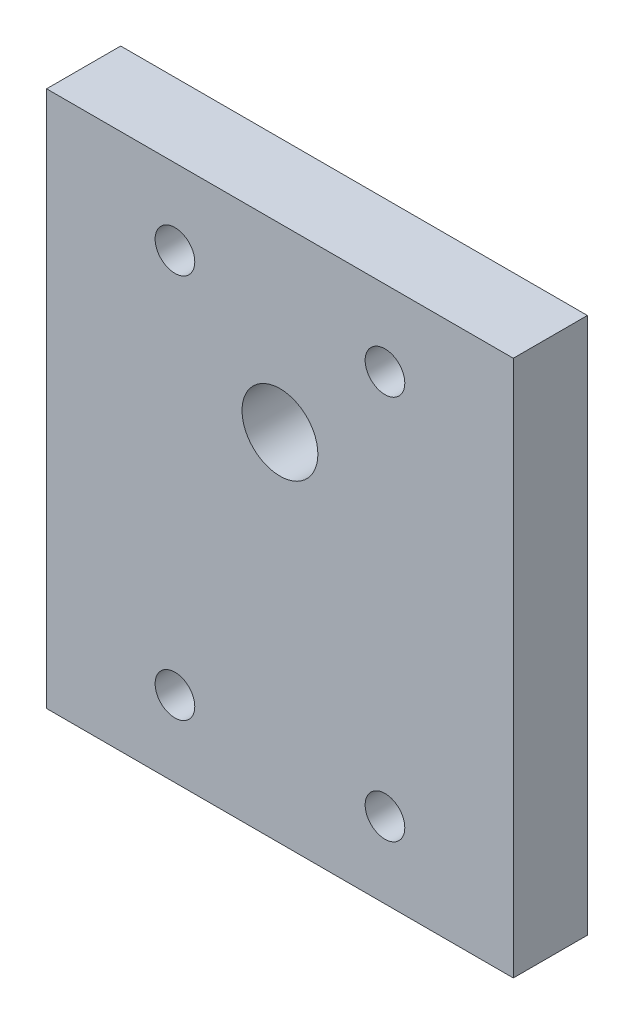
ISO-10303-21;
HEADER;
FILE_DESCRIPTION(('STEP AP214'),'2;1');
FILE_NAME('part.step','',(''),(''),'','','');
FILE_SCHEMA(('AUTOMOTIVE_DESIGN { 1 0 10303 214 1 1 1 1 }'));
ENDSEC;
DATA;
#1=APPLICATION_CONTEXT('core data for automotive mechanical design processes');
#2=APPLICATION_PROTOCOL_DEFINITION('international standard','automotive_design',2000,#1);
#3=PRODUCT_CONTEXT('',#1,'mechanical');
#4=PRODUCT('Part','Part','',(#3));
#5=PRODUCT_RELATED_PRODUCT_CATEGORY('part','',(#4));
#6=PRODUCT_DEFINITION_FORMATION('','',#4);
#7=PRODUCT_DEFINITION_CONTEXT('part definition',#1,'design');
#8=PRODUCT_DEFINITION('design','',#6,#7);
#9=PRODUCT_DEFINITION_SHAPE('','',#8);
#10=(LENGTH_UNIT() NAMED_UNIT(*) SI_UNIT(.MILLI.,.METRE.));
#11=(NAMED_UNIT(*) PLANE_ANGLE_UNIT() SI_UNIT($,.RADIAN.));
#12=(NAMED_UNIT(*) SI_UNIT($,.STERADIAN.) SOLID_ANGLE_UNIT());
#13=UNCERTAINTY_MEASURE_WITH_UNIT(LENGTH_MEASURE(1.E-05),#10,'distance_accuracy_value','');
#14=(GEOMETRIC_REPRESENTATION_CONTEXT(3) GLOBAL_UNCERTAINTY_ASSIGNED_CONTEXT((#13)) GLOBAL_UNIT_ASSIGNED_CONTEXT((#10,
#11,#12)) REPRESENTATION_CONTEXT('',''));
#15=CARTESIAN_POINT('',(0.,0.,0.));
#16=DIRECTION('',(0.,0.,1.));
#17=DIRECTION('',(1.,0.,0.));
#18=AXIS2_PLACEMENT_3D('',#15,#16,#17);
#19=CARTESIAN_POINT('',(0.,0.,6.35));
#20=DIRECTION('',(0.,0.,1.));
#21=DIRECTION('',(1.,0.,0.));
#22=AXIS2_PLACEMENT_3D('',#19,#20,#21);
#23=PLANE('',#22);
#24=CARTESIAN_POINT('',(11.,6.49999999999999,6.35));
#25=DIRECTION('',(0.,0.,1.));
#26=DIRECTION('',(1.,0.,0.));
#27=AXIS2_PLACEMENT_3D('',#24,#25,#26);
#28=CIRCLE('',#27,1.7);
#29=CARTESIAN_POINT('',(12.7,6.49999999999999,6.35));
#30=VERTEX_POINT('',#29);
#31=EDGE_CURVE('E150',#30,#30,#28,.T.);
#32=ORIENTED_EDGE('',*,*,#31,.F.);
#33=EDGE_LOOP('',(#32));
#34=FACE_BOUND('',#33,.T.);
#35=CARTESIAN_POINT('',(11.,39.5,6.35));
#36=DIRECTION('',(0.,0.,1.));
#37=DIRECTION('',(1.,0.,0.));
#38=AXIS2_PLACEMENT_3D('',#35,#36,#37);
#39=CIRCLE('',#38,1.7);
#40=CARTESIAN_POINT('',(12.7,39.5,6.35));
#41=VERTEX_POINT('',#40);
#42=EDGE_CURVE('E134',#41,#41,#39,.T.);
#43=ORIENTED_EDGE('',*,*,#42,.F.);
#44=EDGE_LOOP('',(#43));
#45=FACE_BOUND('',#44,.T.);
#46=DIRECTION('',(0.,1.,0.));
#47=VECTOR('',#46,1.);
#48=CARTESIAN_POINT('',(40.,0.,6.35));
#49=LINE('',#48,#47);
#50=CARTESIAN_POINT('',(40.,0.,6.35));
#51=VERTEX_POINT('',#50);
#52=CARTESIAN_POINT('',(40.,46.,6.35));
#53=VERTEX_POINT('',#52);
#54=EDGE_CURVE('E92',#51,#53,#49,.T.);
#55=ORIENTED_EDGE('',*,*,#54,.T.);
#56=DIRECTION('',(-1.,0.,0.));
#57=VECTOR('',#56,1.);
#58=CARTESIAN_POINT('',(40.,46.,6.35));
#59=LINE('',#58,#57);
#60=CARTESIAN_POINT('',(0.,46.,6.35));
#61=VERTEX_POINT('',#60);
#62=EDGE_CURVE('E87',#53,#61,#59,.T.);
#63=ORIENTED_EDGE('',*,*,#62,.T.);
#64=DIRECTION('',(0.,-1.,0.));
#65=VECTOR('',#64,1.);
#66=CARTESIAN_POINT('',(0.,0.,6.35));
#67=LINE('',#66,#65);
#68=CARTESIAN_POINT('',(0.,0.,6.35));
#69=VERTEX_POINT('',#68);
#70=EDGE_CURVE('E90',#61,#69,#67,.T.);
#71=ORIENTED_EDGE('',*,*,#70,.T.);
#72=DIRECTION('',(1.,0.,0.));
#73=VECTOR('',#72,1.);
#74=CARTESIAN_POINT('',(40.,0.,6.35));
#75=LINE('',#74,#73);
#76=EDGE_CURVE('E57',#69,#51,#75,.T.);
#77=ORIENTED_EDGE('',*,*,#76,.T.);
#78=EDGE_LOOP('',(#55,#63,#71,#77));
#79=FACE_BOUND('',#78,.T.);
#80=CARTESIAN_POINT('',(29.,39.5,6.35));
#81=DIRECTION('',(0.,0.,1.));
#82=DIRECTION('',(1.,0.,0.));
#83=AXIS2_PLACEMENT_3D('',#80,#81,#82);
#84=CIRCLE('',#83,1.7);
#85=CARTESIAN_POINT('',(30.7,39.5,6.35));
#86=VERTEX_POINT('',#85);
#87=EDGE_CURVE('E112',#86,#86,#84,.T.);
#88=ORIENTED_EDGE('',*,*,#87,.F.);
#89=EDGE_LOOP('',(#88));
#90=FACE_BOUND('',#89,.T.);
#91=CARTESIAN_POINT('',(20.,30.5,6.35));
#92=DIRECTION('',(0.,0.,1.));
#93=DIRECTION('',(1.,0.,0.));
#94=AXIS2_PLACEMENT_3D('',#91,#92,#93);
#95=CIRCLE('',#94,3.25);
#96=CARTESIAN_POINT('',(23.25,30.5,6.35));
#97=VERTEX_POINT('',#96);
#98=EDGE_CURVE('E142',#97,#97,#95,.T.);
#99=ORIENTED_EDGE('',*,*,#98,.F.);
#100=EDGE_LOOP('',(#99));
#101=FACE_BOUND('',#100,.T.);
#102=CARTESIAN_POINT('',(29.,6.49999999999999,6.35));
#103=DIRECTION('',(0.,0.,1.));
#104=DIRECTION('',(1.,0.,0.));
#105=AXIS2_PLACEMENT_3D('',#102,#103,#104);
#106=CIRCLE('',#105,1.7);
#107=CARTESIAN_POINT('',(30.7,6.49999999999999,6.35));
#108=VERTEX_POINT('',#107);
#109=EDGE_CURVE('E158',#108,#108,#106,.T.);
#110=ORIENTED_EDGE('',*,*,#109,.F.);
#111=EDGE_LOOP('',(#110));
#112=FACE_BOUND('',#111,.T.);
#113=ADVANCED_FACE('F39',(#34,#45,#79,#90,#101,#112),#23,.T.);
#114=CARTESIAN_POINT('',(0.,0.,0.));
#115=DIRECTION('',(0.,0.,1.));
#116=DIRECTION('',(1.,0.,0.));
#117=AXIS2_PLACEMENT_3D('',#114,#115,#116);
#118=PLANE('',#117);
#119=DIRECTION('',(0.,1.,0.));
#120=VECTOR('',#119,1.);
#121=CARTESIAN_POINT('',(40.,0.,0.));
#122=LINE('',#121,#120);
#123=CARTESIAN_POINT('',(40.,0.,0.));
#124=VERTEX_POINT('',#123);
#125=CARTESIAN_POINT('',(40.,46.,0.));
#126=VERTEX_POINT('',#125);
#127=EDGE_CURVE('E108',#124,#126,#122,.T.);
#128=ORIENTED_EDGE('',*,*,#127,.F.);
#129=DIRECTION('',(1.,0.,0.));
#130=VECTOR('',#129,1.);
#131=CARTESIAN_POINT('',(40.,0.,0.));
#132=LINE('',#131,#130);
#133=CARTESIAN_POINT('',(0.,0.,0.));
#134=VERTEX_POINT('',#133);
#135=EDGE_CURVE('E80',#134,#124,#132,.T.);
#136=ORIENTED_EDGE('',*,*,#135,.F.);
#137=DIRECTION('',(0.,-1.,0.));
#138=VECTOR('',#137,1.);
#139=CARTESIAN_POINT('',(0.,0.,0.));
#140=LINE('',#139,#138);
#141=CARTESIAN_POINT('',(0.,46.,0.));
#142=VERTEX_POINT('',#141);
#143=EDGE_CURVE('E74',#142,#134,#140,.T.);
#144=ORIENTED_EDGE('',*,*,#143,.F.);
#145=DIRECTION('',(-1.,0.,0.));
#146=VECTOR('',#145,1.);
#147=CARTESIAN_POINT('',(40.,46.,0.));
#148=LINE('',#147,#146);
#149=EDGE_CURVE('E97',#126,#142,#148,.T.);
#150=ORIENTED_EDGE('',*,*,#149,.F.);
#151=EDGE_LOOP('',(#128,#136,#144,#150));
#152=FACE_BOUND('',#151,.T.);
#153=CARTESIAN_POINT('',(29.,39.5,0.));
#154=DIRECTION('',(0.,0.,1.));
#155=DIRECTION('',(1.,0.,0.));
#156=AXIS2_PLACEMENT_3D('',#153,#154,#155);
#157=CIRCLE('',#156,1.7);
#158=CARTESIAN_POINT('',(30.7,39.5,0.));
#159=VERTEX_POINT('',#158);
#160=EDGE_CURVE('E130',#159,#159,#157,.T.);
#161=ORIENTED_EDGE('',*,*,#160,.T.);
#162=EDGE_LOOP('',(#161));
#163=FACE_BOUND('',#162,.T.);
#164=CARTESIAN_POINT('',(11.,39.5,0.));
#165=DIRECTION('',(0.,0.,1.));
#166=DIRECTION('',(1.,0.,0.));
#167=AXIS2_PLACEMENT_3D('',#164,#165,#166);
#168=CIRCLE('',#167,1.7);
#169=CARTESIAN_POINT('',(12.7,39.5,0.));
#170=VERTEX_POINT('',#169);
#171=EDGE_CURVE('E138',#170,#170,#168,.T.);
#172=ORIENTED_EDGE('',*,*,#171,.T.);
#173=EDGE_LOOP('',(#172));
#174=FACE_BOUND('',#173,.T.);
#175=CARTESIAN_POINT('',(20.,30.5,0.));
#176=DIRECTION('',(0.,0.,1.));
#177=DIRECTION('',(1.,0.,0.));
#178=AXIS2_PLACEMENT_3D('',#175,#176,#177);
#179=CIRCLE('',#178,3.25);
#180=CARTESIAN_POINT('',(23.25,30.5,0.));
#181=VERTEX_POINT('',#180);
#182=EDGE_CURVE('E146',#181,#181,#179,.T.);
#183=ORIENTED_EDGE('',*,*,#182,.T.);
#184=EDGE_LOOP('',(#183));
#185=FACE_BOUND('',#184,.T.);
#186=CARTESIAN_POINT('',(11.,6.49999999999999,0.));
#187=DIRECTION('',(0.,0.,1.));
#188=DIRECTION('',(1.,0.,0.));
#189=AXIS2_PLACEMENT_3D('',#186,#187,#188);
#190=CIRCLE('',#189,1.7);
#191=CARTESIAN_POINT('',(12.7,6.49999999999999,0.));
#192=VERTEX_POINT('',#191);
#193=EDGE_CURVE('E154',#192,#192,#190,.T.);
#194=ORIENTED_EDGE('',*,*,#193,.T.);
#195=EDGE_LOOP('',(#194));
#196=FACE_BOUND('',#195,.T.);
#197=CARTESIAN_POINT('',(29.,6.49999999999999,0.));
#198=DIRECTION('',(0.,0.,1.));
#199=DIRECTION('',(1.,0.,0.));
#200=AXIS2_PLACEMENT_3D('',#197,#198,#199);
#201=CIRCLE('',#200,1.7);
#202=CARTESIAN_POINT('',(30.7,6.49999999999999,0.));
#203=VERTEX_POINT('',#202);
#204=EDGE_CURVE('E162',#203,#203,#201,.T.);
#205=ORIENTED_EDGE('',*,*,#204,.T.);
#206=EDGE_LOOP('',(#205));
#207=FACE_BOUND('',#206,.T.);
#208=ADVANCED_FACE('F125',(#152,#163,#174,#185,#196,#207),#118,.F.);
#209=CARTESIAN_POINT('',(40.,0.,6.35));
#210=DIRECTION('',(-1.,0.,0.));
#211=DIRECTION('',(0.,0.,1.));
#212=AXIS2_PLACEMENT_3D('',#209,#210,#211);
#213=PLANE('',#212);
#214=ORIENTED_EDGE('',*,*,#127,.T.);
#215=DIRECTION('',(0.,0.,-1.));
#216=VECTOR('',#215,1.);
#217=CARTESIAN_POINT('',(40.,46.,6.35));
#218=LINE('',#217,#216);
#219=EDGE_CURVE('E11',#53,#126,#218,.T.);
#220=ORIENTED_EDGE('',*,*,#219,.F.);
#221=ORIENTED_EDGE('',*,*,#54,.F.);
#222=DIRECTION('',(0.,0.,-1.));
#223=VECTOR('',#222,1.);
#224=CARTESIAN_POINT('',(40.,0.,6.35));
#225=LINE('',#224,#223);
#226=EDGE_CURVE('E104',#51,#124,#225,.T.);
#227=ORIENTED_EDGE('',*,*,#226,.T.);
#228=EDGE_LOOP('',(#214,#220,#221,#227));
#229=FACE_BOUND('',#228,.T.);
#230=ADVANCED_FACE('F41',(#229),#213,.F.);
#231=CARTESIAN_POINT('',(40.,46.,6.35));
#232=DIRECTION('',(0.,-1.,0.));
#233=DIRECTION('',(0.,0.,-1.));
#234=AXIS2_PLACEMENT_3D('',#231,#232,#233);
#235=PLANE('',#234);
#236=ORIENTED_EDGE('',*,*,#149,.T.);
#237=DIRECTION('',(0.,0.,-1.));
#238=VECTOR('',#237,1.);
#239=CARTESIAN_POINT('',(0.,46.,6.35));
#240=LINE('',#239,#238);
#241=EDGE_CURVE('E49',#61,#142,#240,.T.);
#242=ORIENTED_EDGE('',*,*,#241,.F.);
#243=ORIENTED_EDGE('',*,*,#62,.F.);
#244=ORIENTED_EDGE('',*,*,#219,.T.);
#245=EDGE_LOOP('',(#236,#242,#243,#244));
#246=FACE_BOUND('',#245,.T.);
#247=ADVANCED_FACE('F96',(#246),#235,.F.);
#248=CARTESIAN_POINT('',(0.,0.,6.35));
#249=DIRECTION('',(1.,0.,0.));
#250=DIRECTION('',(0.,0.,-1.));
#251=AXIS2_PLACEMENT_3D('',#248,#249,#250);
#252=PLANE('',#251);
#253=ORIENTED_EDGE('',*,*,#143,.T.);
#254=DIRECTION('',(0.,0.,-1.));
#255=VECTOR('',#254,1.);
#256=CARTESIAN_POINT('',(0.,0.,6.35));
#257=LINE('',#256,#255);
#258=EDGE_CURVE('E99',#69,#134,#257,.T.);
#259=ORIENTED_EDGE('',*,*,#258,.F.);
#260=ORIENTED_EDGE('',*,*,#70,.F.);
#261=ORIENTED_EDGE('',*,*,#241,.T.);
#262=EDGE_LOOP('',(#253,#259,#260,#261));
#263=FACE_BOUND('',#262,.T.);
#264=ADVANCED_FACE('F100',(#263),#252,.F.);
#265=CARTESIAN_POINT('',(40.,0.,6.35));
#266=DIRECTION('',(0.,1.,0.));
#267=DIRECTION('',(-1.,0.,0.));
#268=AXIS2_PLACEMENT_3D('',#265,#266,#267);
#269=PLANE('',#268);
#270=ORIENTED_EDGE('',*,*,#135,.T.);
#271=ORIENTED_EDGE('',*,*,#226,.F.);
#272=ORIENTED_EDGE('',*,*,#76,.F.);
#273=ORIENTED_EDGE('',*,*,#258,.T.);
#274=EDGE_LOOP('',(#270,#271,#272,#273));
#275=FACE_BOUND('',#274,.T.);
#276=ADVANCED_FACE('F122',(#275),#269,.F.);
#277=CARTESIAN_POINT('',(29.,39.5,6.35));
#278=DIRECTION('',(0.,0.,-1.));
#279=DIRECTION('',(-1.,0.,0.));
#280=AXIS2_PLACEMENT_3D('',#277,#278,#279);
#281=CYLINDRICAL_SURFACE('',#280,1.7);
#282=ORIENTED_EDGE('',*,*,#87,.T.);
#283=EDGE_LOOP('',(#282));
#284=FACE_BOUND('',#283,.T.);
#285=ORIENTED_EDGE('',*,*,#160,.F.);
#286=EDGE_LOOP('',(#285));
#287=FACE_BOUND('',#286,.T.);
#288=ADVANCED_FACE('F183',(#284,#287),#281,.F.);
#289=CARTESIAN_POINT('',(11.,39.5,6.35));
#290=DIRECTION('',(0.,0.,-1.));
#291=DIRECTION('',(-1.,0.,0.));
#292=AXIS2_PLACEMENT_3D('',#289,#290,#291);
#293=CYLINDRICAL_SURFACE('',#292,1.7);
#294=ORIENTED_EDGE('',*,*,#42,.T.);
#295=EDGE_LOOP('',(#294));
#296=FACE_BOUND('',#295,.T.);
#297=ORIENTED_EDGE('',*,*,#171,.F.);
#298=EDGE_LOOP('',(#297));
#299=FACE_BOUND('',#298,.T.);
#300=ADVANCED_FACE('F229',(#296,#299),#293,.F.);
#301=CARTESIAN_POINT('',(20.,30.5,6.35));
#302=DIRECTION('',(0.,0.,-1.));
#303=DIRECTION('',(-1.,0.,0.));
#304=AXIS2_PLACEMENT_3D('',#301,#302,#303);
#305=CYLINDRICAL_SURFACE('',#304,3.25);
#306=ORIENTED_EDGE('',*,*,#98,.T.);
#307=EDGE_LOOP('',(#306));
#308=FACE_BOUND('',#307,.T.);
#309=ORIENTED_EDGE('',*,*,#182,.F.);
#310=EDGE_LOOP('',(#309));
#311=FACE_BOUND('',#310,.T.);
#312=ADVANCED_FACE('F237',(#308,#311),#305,.F.);
#313=CARTESIAN_POINT('',(11.,6.49999999999999,6.35));
#314=DIRECTION('',(0.,0.,-1.));
#315=DIRECTION('',(-1.,0.,0.));
#316=AXIS2_PLACEMENT_3D('',#313,#314,#315);
#317=CYLINDRICAL_SURFACE('',#316,1.7);
#318=ORIENTED_EDGE('',*,*,#31,.T.);
#319=EDGE_LOOP('',(#318));
#320=FACE_BOUND('',#319,.T.);
#321=ORIENTED_EDGE('',*,*,#193,.F.);
#322=EDGE_LOOP('',(#321));
#323=FACE_BOUND('',#322,.T.);
#324=ADVANCED_FACE('F245',(#320,#323),#317,.F.);
#325=CARTESIAN_POINT('',(29.,6.49999999999999,6.35));
#326=DIRECTION('',(0.,0.,-1.));
#327=DIRECTION('',(-1.,0.,0.));
#328=AXIS2_PLACEMENT_3D('',#325,#326,#327);
#329=CYLINDRICAL_SURFACE('',#328,1.7);
#330=ORIENTED_EDGE('',*,*,#109,.T.);
#331=EDGE_LOOP('',(#330));
#332=FACE_BOUND('',#331,.T.);
#333=ORIENTED_EDGE('',*,*,#204,.F.);
#334=EDGE_LOOP('',(#333));
#335=FACE_BOUND('',#334,.T.);
#336=ADVANCED_FACE('F170',(#332,#335),#329,.F.);
#337=CLOSED_SHELL('',(#113,#208,#230,#247,#264,#276,#288,#300,#312,#324,#336));
#338=MANIFOLD_SOLID_BREP('B2',#337);
#339=ADVANCED_BREP_SHAPE_REPRESENTATION('',(#18,#338),#14);
#340=SHAPE_DEFINITION_REPRESENTATION(#9,#339);
ENDSEC;
END-ISO-10303-21;
